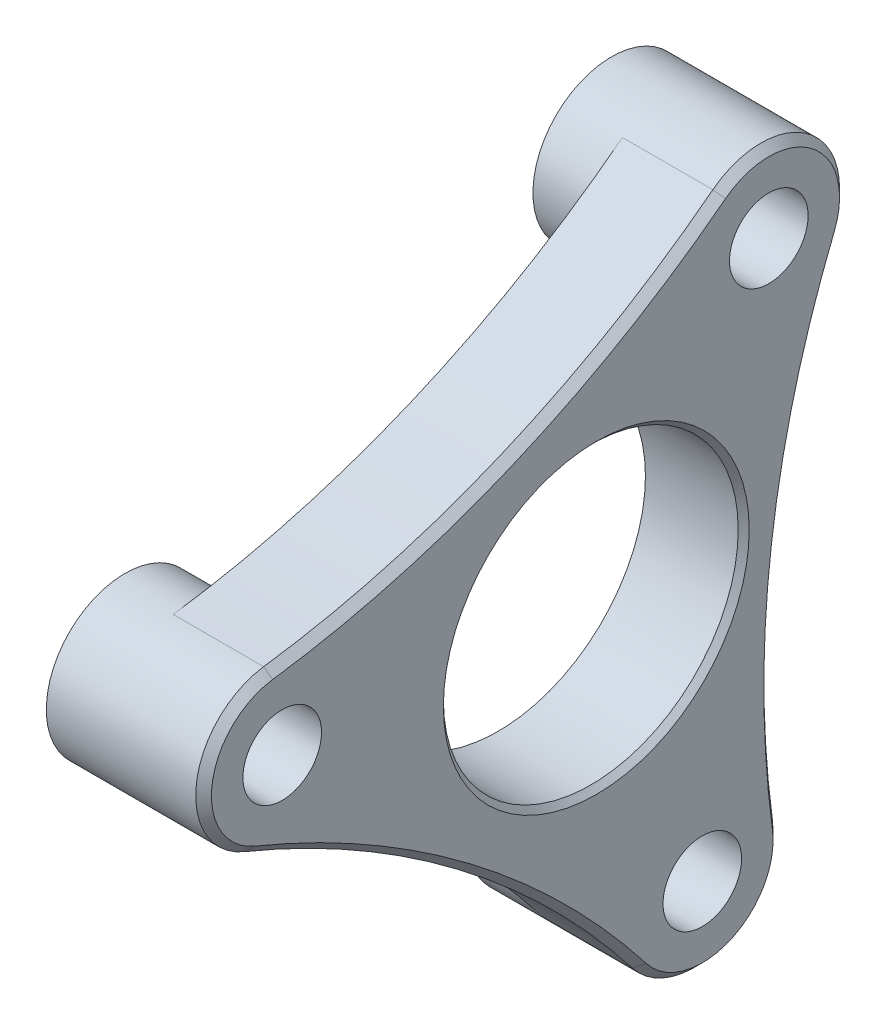
ISO-10303-21;
HEADER;
FILE_DESCRIPTION(('STEP AP214'),'2;1');
FILE_NAME('part.step','',(''),(''),'','','');
FILE_SCHEMA(('AUTOMOTIVE_DESIGN { 1 0 10303 214 1 1 1 1 }'));
ENDSEC;
DATA;
#1=APPLICATION_CONTEXT('core data for automotive mechanical design processes');
#2=APPLICATION_PROTOCOL_DEFINITION('international standard','automotive_design',2000,#1);
#3=PRODUCT_CONTEXT('',#1,'mechanical');
#4=PRODUCT('Part','Part','',(#3));
#5=PRODUCT_RELATED_PRODUCT_CATEGORY('part','',(#4));
#6=PRODUCT_DEFINITION_FORMATION('','',#4);
#7=PRODUCT_DEFINITION_CONTEXT('part definition',#1,'design');
#8=PRODUCT_DEFINITION('design','',#6,#7);
#9=PRODUCT_DEFINITION_SHAPE('','',#8);
#10=(LENGTH_UNIT() NAMED_UNIT(*) SI_UNIT(.MILLI.,.METRE.));
#11=(NAMED_UNIT(*) PLANE_ANGLE_UNIT() SI_UNIT($,.RADIAN.));
#12=(NAMED_UNIT(*) SI_UNIT($,.STERADIAN.) SOLID_ANGLE_UNIT());
#13=UNCERTAINTY_MEASURE_WITH_UNIT(LENGTH_MEASURE(1.E-05),#10,'distance_accuracy_value','');
#14=(GEOMETRIC_REPRESENTATION_CONTEXT(3) GLOBAL_UNCERTAINTY_ASSIGNED_CONTEXT((#13)) GLOBAL_UNIT_ASSIGNED_CONTEXT((#10,
#11,#12)) REPRESENTATION_CONTEXT('',''));
#15=CARTESIAN_POINT('',(0.,0.,0.));
#16=DIRECTION('',(0.,0.,1.));
#17=DIRECTION('',(1.,0.,0.));
#18=AXIS2_PLACEMENT_3D('',#15,#16,#17);
#19=CARTESIAN_POINT('',(-887.349,290.5125,-1549.4));
#20=DIRECTION('',(-1.,0.,0.));
#21=DIRECTION('',(0.,0.,1.));
#22=AXIS2_PLACEMENT_3D('',#19,#20,#21);
#23=CYLINDRICAL_SURFACE('',#22,23.8124999999999);
#24=CARTESIAN_POINT('',(-901.7,290.5125,-1549.4));
#25=DIRECTION('',(1.,0.,0.));
#26=DIRECTION('',(0.,0.,-1.));
#27=AXIS2_PLACEMENT_3D('',#24,#25,#26);
#28=CIRCLE('',#27,23.8124999999999);
#29=CARTESIAN_POINT('',(-901.7,290.5125,-1573.2125));
#30=VERTEX_POINT('',#29);
#31=EDGE_CURVE('E164',#30,#30,#28,.F.);
#32=ORIENTED_EDGE('',*,*,#31,.T.);
#33=EDGE_LOOP('',(#32));
#34=FACE_BOUND('',#33,.T.);
#35=CARTESIAN_POINT('',(-886.714,290.5125,-1549.4));
#36=DIRECTION('',(1.,0.,0.));
#37=DIRECTION('',(0.,0.,-1.));
#38=AXIS2_PLACEMENT_3D('',#35,#36,#37);
#39=CIRCLE('',#38,23.8124999999999);
#40=CARTESIAN_POINT('',(-886.714,290.5125,-1573.2125));
#41=VERTEX_POINT('',#40);
#42=EDGE_CURVE('E227',#41,#41,#39,.T.);
#43=ORIENTED_EDGE('',*,*,#42,.T.);
#44=EDGE_LOOP('',(#43));
#45=FACE_BOUND('',#44,.T.);
#46=ADVANCED_FACE('F37',(#34,#45),#23,.F.);
#47=CARTESIAN_POINT('',(-885.825,245.132576197376,-1566.52698056338));
#48=DIRECTION('',(-1.,0.,0.));
#49=DIRECTION('',(0.,0.,1.));
#50=AXIS2_PLACEMENT_3D('',#47,#48,#49);
#51=CYLINDRICAL_SURFACE('',#50,6.35000000000017);
#52=CARTESIAN_POINT('',(-885.825,245.132576197376,-1566.52698056338));
#53=DIRECTION('',(1.,0.,0.));
#54=DIRECTION('',(0.,0.,-1.));
#55=AXIS2_PLACEMENT_3D('',#52,#53,#54);
#56=CIRCLE('',#55,6.35000000000017);
#57=CARTESIAN_POINT('',(-885.825,245.132576197376,-1572.87698056338));
#58=VERTEX_POINT('',#57);
#59=EDGE_CURVE('E223',#58,#58,#56,.F.);
#60=ORIENTED_EDGE('',*,*,#59,.F.);
#61=EDGE_LOOP('',(#60));
#62=FACE_BOUND('',#61,.T.);
#63=CARTESIAN_POINT('',(-911.225,245.132576197376,-1566.52698056338));
#64=DIRECTION('',(1.,0.,0.));
#65=DIRECTION('',(0.,0.,-1.));
#66=AXIS2_PLACEMENT_3D('',#63,#64,#65);
#67=CIRCLE('',#66,6.35000000000017);
#68=CARTESIAN_POINT('',(-911.225,245.132576197376,-1572.87698056338));
#69=VERTEX_POINT('',#68);
#70=EDGE_CURVE('E218',#69,#69,#67,.F.);
#71=ORIENTED_EDGE('',*,*,#70,.T.);
#72=EDGE_LOOP('',(#71));
#73=FACE_BOUND('',#72,.T.);
#74=ADVANCED_FACE('F248',(#62,#73),#51,.F.);
#75=CARTESIAN_POINT('',(-885.825,245.132576197376,-1566.52698056338));
#76=DIRECTION('',(-1.,0.,0.));
#77=DIRECTION('',(0.,0.,1.));
#78=AXIS2_PLACEMENT_3D('',#75,#76,#77);
#79=CYLINDRICAL_SURFACE('',#78,12.6999999999999);
#80=DIRECTION('',(-1.,0.,0.));
#81=VECTOR('',#80,1.);
#82=CARTESIAN_POINT('',(-746.033840721288,246.83893817334,-1579.11182576731));
#83=LINE('',#82,#81);
#84=CARTESIAN_POINT('',(-887.095,246.83893817334,-1579.11182576731));
#85=VERTEX_POINT('',#84);
#86=CARTESIAN_POINT('',(-901.7,246.83893817334,-1579.11182576731));
#87=VERTEX_POINT('',#86);
#88=EDGE_CURVE('E217',#85,#87,#83,.T.);
#89=ORIENTED_EDGE('',*,*,#88,.F.);
#90=CARTESIAN_POINT('',(-887.095,245.132576197376,-1566.52698056338));
#91=DIRECTION('',(1.,0.,0.));
#92=DIRECTION('',(0.,0.,-1.));
#93=AXIS2_PLACEMENT_3D('',#90,#91,#92);
#94=CIRCLE('',#93,12.6999999999999);
#95=CARTESIAN_POINT('',(-887.095,237.348331115271,-1556.4922643989));
#96=VERTEX_POINT('',#95);
#97=EDGE_CURVE('E180',#85,#96,#94,.F.);
#98=ORIENTED_EDGE('',*,*,#97,.T.);
#99=DIRECTION('',(-1.,0.,0.));
#100=VECTOR('',#99,1.);
#101=CARTESIAN_POINT('',(-746.033840721288,237.348331115271,-1556.4922643989));
#102=LINE('',#101,#100);
#103=CARTESIAN_POINT('',(-901.7,237.348331115271,-1556.4922643989));
#104=VERTEX_POINT('',#103);
#105=EDGE_CURVE('E131',#96,#104,#102,.T.);
#106=ORIENTED_EDGE('',*,*,#105,.T.);
#107=CARTESIAN_POINT('',(-901.7,245.132576197376,-1566.52698056338));
#108=DIRECTION('',(1.,0.,0.));
#109=DIRECTION('',(0.,0.,-1.));
#110=AXIS2_PLACEMENT_3D('',#107,#108,#109);
#111=CIRCLE('',#110,12.6999999999999);
#112=EDGE_CURVE('E142',#87,#104,#111,.T.);
#113=ORIENTED_EDGE('',*,*,#112,.F.);
#114=EDGE_LOOP('',(#89,#98,#106,#113));
#115=FACE_BOUND('',#114,.T.);
#116=CARTESIAN_POINT('',(-911.225,245.132576197376,-1566.52698056338));
#117=DIRECTION('',(1.,0.,0.));
#118=DIRECTION('',(0.,0.,-1.));
#119=AXIS2_PLACEMENT_3D('',#116,#117,#118);
#120=CIRCLE('',#119,12.6999999999999);
#121=CARTESIAN_POINT('',(-911.225,245.132576197376,-1579.22698056338));
#122=VERTEX_POINT('',#121);
#123=EDGE_CURVE('E226',#122,#122,#120,.T.);
#124=ORIENTED_EDGE('',*,*,#123,.T.);
#125=EDGE_LOOP('',(#124));
#126=FACE_BOUND('',#125,.T.);
#127=ADVANCED_FACE('F254',(#115,#126),#79,.T.);
#128=CARTESIAN_POINT('',(-885.825,0.,0.));
#129=DIRECTION('',(1.,0.,0.));
#130=DIRECTION('',(0.,0.,-1.));
#131=AXIS2_PLACEMENT_3D('',#128,#129,#130);
#132=PLANE('',#131);
#133=CARTESIAN_POINT('',(-885.825,143.937390130013,-1436.07567042511));
#134=DIRECTION('',(1.,0.,0.));
#135=DIRECTION('',(0.,0.,-1.));
#136=AXIS2_PLACEMENT_3D('',#133,#134,#135);
#137=CIRCLE('',#136,153.67);
#138=CARTESIAN_POINT('',(-885.825,286.136307441143,-1494.33317479615));
#139=VERTEX_POINT('',#138);
#140=CARTESIAN_POINT('',(-885.825,238.126755623482,-1557.49573601534));
#141=VERTEX_POINT('',#140);
#142=EDGE_CURVE('E175',#139,#141,#137,.F.);
#143=ORIENTED_EDGE('',*,*,#142,.T.);
#144=CARTESIAN_POINT('',(-885.825,245.132576197376,-1566.52698056338));
#145=DIRECTION('',(1.,0.,0.));
#146=DIRECTION('',(0.,0.,-1.));
#147=AXIS2_PLACEMENT_3D('',#144,#145,#146);
#148=CIRCLE('',#147,11.43);
#149=CARTESIAN_POINT('',(-885.825,246.668301975743,-1577.85334124692));
#150=VERTEX_POINT('',#149);
#151=EDGE_CURVE('E177',#141,#150,#148,.T.);
#152=ORIENTED_EDGE('',*,*,#151,.T.);
#153=CARTESIAN_POINT('',(-885.825,267.315281884901,-1730.12996821452));
#154=DIRECTION('',(1.,0.,0.));
#155=DIRECTION('',(0.,0.,-1.));
#156=AXIS2_PLACEMENT_3D('',#153,#154,#155);
#157=CIRCLE('',#156,153.67);
#158=CARTESIAN_POINT('',(-885.825,325.373460468486,-1587.84955213572));
#159=VERTEX_POINT('',#158);
#160=EDGE_CURVE('E173',#150,#159,#157,.F.);
#161=ORIENTED_EDGE('',*,*,#160,.T.);
#162=CARTESIAN_POINT('',(-885.825,329.691837387926,-1577.26671127036));
#163=DIRECTION('',(1.,0.,0.));
#164=DIRECTION('',(0.,0.,-1.));
#165=AXIS2_PLACEMENT_3D('',#162,#163,#164);
#166=CIRCLE('',#165,11.43);
#167=CARTESIAN_POINT('',(-885.825,338.732890583114,-1570.27355339127));
#168=VERTEX_POINT('',#167);
#169=EDGE_CURVE('E169',#159,#168,#166,.T.);
#170=ORIENTED_EDGE('',*,*,#169,.T.);
#171=CARTESIAN_POINT('',(-885.825,460.284827985087,-1476.25443079471));
#172=DIRECTION('',(1.,0.,0.));
#173=DIRECTION('',(0.,0.,-1.));
#174=AXIS2_PLACEMENT_3D('',#171,#172,#173);
#175=CIRCLE('',#174,153.67);
#176=CARTESIAN_POINT('',(-885.825,308.037283908033,-1497.11478128328));
#177=VERTEX_POINT('',#176);
#178=EDGE_CURVE('E161',#168,#177,#175,.F.);
#179=ORIENTED_EDGE('',*,*,#178,.T.);
#180=CARTESIAN_POINT('',(-885.825,296.713086414699,-1498.66637760061));
#181=DIRECTION('',(1.,0.,0.));
#182=DIRECTION('',(0.,0.,-1.));
#183=AXIS2_PLACEMENT_3D('',#180,#181,#182);
#184=CIRCLE('',#183,11.43);
#185=EDGE_CURVE('E171',#177,#139,#184,.T.);
#186=ORIENTED_EDGE('',*,*,#185,.T.);
#187=EDGE_LOOP('',(#143,#152,#161,#170,#179,#186));
#188=FACE_BOUND('',#187,.T.);
#189=CARTESIAN_POINT('',(-885.825,290.5125,-1549.4));
#190=DIRECTION('',(1.,0.,0.));
#191=DIRECTION('',(0.,0.,-1.));
#192=AXIS2_PLACEMENT_3D('',#189,#190,#191);
#193=CIRCLE('',#192,24.7014999999999);
#194=CARTESIAN_POINT('',(-885.825,290.5125,-1574.1015));
#195=VERTEX_POINT('',#194);
#196=EDGE_CURVE('E167',#195,#195,#193,.F.);
#197=ORIENTED_EDGE('',*,*,#196,.T.);
#198=EDGE_LOOP('',(#197));
#199=FACE_BOUND('',#198,.T.);
#200=ORIENTED_EDGE('',*,*,#59,.T.);
#201=EDGE_LOOP('',(#200));
#202=FACE_BOUND('',#201,.T.);
#203=CARTESIAN_POINT('',(-885.825,296.713086414699,-1498.66637760061));
#204=DIRECTION('',(1.,0.,0.));
#205=DIRECTION('',(0.,0.,-1.));
#206=AXIS2_PLACEMENT_3D('',#203,#204,#205);
#207=CIRCLE('',#206,6.35000000000017);
#208=CARTESIAN_POINT('',(-885.825,296.713086414699,-1505.01637760061));
#209=VERTEX_POINT('',#208);
#210=EDGE_CURVE('E149',#209,#209,#207,.F.);
#211=ORIENTED_EDGE('',*,*,#210,.T.);
#212=EDGE_LOOP('',(#211));
#213=FACE_BOUND('',#212,.T.);
#214=CARTESIAN_POINT('',(-885.825,329.691837387926,-1577.26671127036));
#215=DIRECTION('',(1.,0.,0.));
#216=DIRECTION('',(0.,0.,-1.));
#217=AXIS2_PLACEMENT_3D('',#214,#215,#216);
#218=CIRCLE('',#217,6.35000000000017);
#219=CARTESIAN_POINT('',(-885.825,329.691837387926,-1583.61671127036));
#220=VERTEX_POINT('',#219);
#221=EDGE_CURVE('E152',#220,#220,#218,.F.);
#222=ORIENTED_EDGE('',*,*,#221,.T.);
#223=EDGE_LOOP('',(#222));
#224=FACE_BOUND('',#223,.T.);
#225=ADVANCED_FACE('F237',(#188,#199,#202,#213,#224),#132,.T.);
#226=CARTESIAN_POINT('',(-911.225,0.,0.));
#227=DIRECTION('',(1.,0.,0.));
#228=DIRECTION('',(0.,0.,-1.));
#229=AXIS2_PLACEMENT_3D('',#226,#227,#228);
#230=PLANE('',#229);
#231=ORIENTED_EDGE('',*,*,#70,.F.);
#232=EDGE_LOOP('',(#231));
#233=FACE_BOUND('',#232,.T.);
#234=ORIENTED_EDGE('',*,*,#123,.F.);
#235=EDGE_LOOP('',(#234));
#236=FACE_BOUND('',#235,.T.);
#237=ADVANCED_FACE('F281',(#233,#236),#230,.F.);
#238=CARTESIAN_POINT('',(-901.7,0.,0.));
#239=DIRECTION('',(1.,0.,0.));
#240=DIRECTION('',(0.,0.,-1.));
#241=AXIS2_PLACEMENT_3D('',#238,#239,#240);
#242=PLANE('',#241);
#243=ORIENTED_EDGE('',*,*,#31,.F.);
#244=EDGE_LOOP('',(#243));
#245=FACE_BOUND('',#244,.T.);
#246=CARTESIAN_POINT('',(-901.7,267.315281884901,-1730.12996821452));
#247=DIRECTION('',(1.,0.,0.));
#248=DIRECTION('',(0.,0.,-1.));
#249=AXIS2_PLACEMENT_3D('',#246,#247,#248);
#250=CIRCLE('',#249,152.4);
#251=CARTESIAN_POINT('',(-901.7,324.89364081077,-1589.02542334298));
#252=VERTEX_POINT('',#251);
#253=EDGE_CURVE('E136',#252,#87,#250,.T.);
#254=ORIENTED_EDGE('',*,*,#253,.T.);
#255=ORIENTED_EDGE('',*,*,#112,.T.);
#256=CARTESIAN_POINT('',(-901.7,143.937390130013,-1436.07567042511));
#257=DIRECTION('',(1.,0.,0.));
#258=DIRECTION('',(0.,0.,-1.));
#259=AXIS2_PLACEMENT_3D('',#256,#257,#258);
#260=CIRCLE('',#259,152.4);
#261=CARTESIAN_POINT('',(-901.7,284.961109777415,-1493.85170781788));
#262=VERTEX_POINT('',#261);
#263=EDGE_CURVE('E140',#104,#262,#260,.T.);
#264=ORIENTED_EDGE('',*,*,#263,.T.);
#265=CARTESIAN_POINT('',(-901.7,296.713086414699,-1498.66637760061));
#266=DIRECTION('',(1.,0.,0.));
#267=DIRECTION('',(0.,0.,-1.));
#268=AXIS2_PLACEMENT_3D('',#265,#266,#267);
#269=CIRCLE('',#268,12.6999999999999);
#270=CARTESIAN_POINT('',(-901.7,309.295528073959,-1496.94238169246));
#271=VERTEX_POINT('',#270);
#272=EDGE_CURVE('E126',#262,#271,#269,.T.);
#273=ORIENTED_EDGE('',*,*,#272,.T.);
#274=CARTESIAN_POINT('',(-901.7,460.284827985087,-1476.25443079471));
#275=DIRECTION('',(1.,0.,0.));
#276=DIRECTION('',(0.,0.,-1.));
#277=AXIS2_PLACEMENT_3D('',#274,#275,#276);
#278=CIRCLE('',#277,152.4);
#279=CARTESIAN_POINT('',(-901.7,339.737452049246,-1569.49653584915));
#280=VERTEX_POINT('',#279);
#281=EDGE_CURVE('E110',#271,#280,#278,.T.);
#282=ORIENTED_EDGE('',*,*,#281,.T.);
#283=CARTESIAN_POINT('',(-901.7,329.691837387926,-1577.26671127036));
#284=DIRECTION('',(1.,0.,0.));
#285=DIRECTION('',(0.,0.,-1.));
#286=AXIS2_PLACEMENT_3D('',#283,#284,#285);
#287=CIRCLE('',#286,12.6999999999999);
#288=EDGE_CURVE('E122',#280,#252,#287,.T.);
#289=ORIENTED_EDGE('',*,*,#288,.T.);
#290=EDGE_LOOP('',(#254,#255,#264,#273,#282,#289));
#291=FACE_BOUND('',#290,.T.);
#292=ADVANCED_FACE('F121',(#245,#291),#242,.F.);
#293=CARTESIAN_POINT('',(-746.033840721288,143.937390130013,-1436.07567042511));
#294=DIRECTION('',(-1.,0.,0.));
#295=DIRECTION('',(0.,0.,1.));
#296=AXIS2_PLACEMENT_3D('',#293,#294,#295);
#297=CYLINDRICAL_SURFACE('',#296,152.4);
#298=ORIENTED_EDGE('',*,*,#105,.F.);
#299=CARTESIAN_POINT('',(-887.095,143.937390130013,-1436.07567042511));
#300=DIRECTION('',(1.,0.,0.));
#301=DIRECTION('',(0.,0.,-1.));
#302=AXIS2_PLACEMENT_3D('',#299,#300,#301);
#303=CIRCLE('',#302,152.4);
#304=CARTESIAN_POINT('',(-887.095,284.961109777415,-1493.85170781788));
#305=VERTEX_POINT('',#304);
#306=EDGE_CURVE('E183',#96,#305,#303,.T.);
#307=ORIENTED_EDGE('',*,*,#306,.T.);
#308=DIRECTION('',(-1.,0.,0.));
#309=VECTOR('',#308,1.);
#310=CARTESIAN_POINT('',(-746.033840721288,284.961109777415,-1493.85170781788));
#311=LINE('',#310,#309);
#312=EDGE_CURVE('E133',#305,#262,#311,.T.);
#313=ORIENTED_EDGE('',*,*,#312,.T.);
#314=ORIENTED_EDGE('',*,*,#263,.F.);
#315=EDGE_LOOP('',(#298,#307,#313,#314));
#316=FACE_BOUND('',#315,.T.);
#317=ADVANCED_FACE('F280',(#316),#297,.F.);
#318=CARTESIAN_POINT('',(-746.033840721288,460.284827985087,-1476.25443079471));
#319=DIRECTION('',(-1.,0.,0.));
#320=DIRECTION('',(0.,0.,1.));
#321=AXIS2_PLACEMENT_3D('',#318,#319,#320);
#322=CYLINDRICAL_SURFACE('',#321,152.4);
#323=DIRECTION('',(-1.,0.,0.));
#324=VECTOR('',#323,1.);
#325=CARTESIAN_POINT('',(-746.033840721288,309.295528073959,-1496.94238169246));
#326=LINE('',#325,#324);
#327=CARTESIAN_POINT('',(-887.095,309.295528073959,-1496.94238169246));
#328=VERTEX_POINT('',#327);
#329=EDGE_CURVE('E114',#328,#271,#326,.T.);
#330=ORIENTED_EDGE('',*,*,#329,.F.);
#331=CARTESIAN_POINT('',(-887.095,460.284827985087,-1476.25443079471));
#332=DIRECTION('',(1.,0.,0.));
#333=DIRECTION('',(0.,0.,-1.));
#334=AXIS2_PLACEMENT_3D('',#331,#332,#333);
#335=CIRCLE('',#334,152.4);
#336=CARTESIAN_POINT('',(-887.095,339.737452049246,-1569.49653584915));
#337=VERTEX_POINT('',#336);
#338=EDGE_CURVE('E11',#328,#337,#335,.T.);
#339=ORIENTED_EDGE('',*,*,#338,.T.);
#340=DIRECTION('',(-1.,0.,0.));
#341=VECTOR('',#340,1.);
#342=CARTESIAN_POINT('',(-746.033840721288,339.737452049246,-1569.49653584915));
#343=LINE('',#342,#341);
#344=EDGE_CURVE('E107',#337,#280,#343,.T.);
#345=ORIENTED_EDGE('',*,*,#344,.T.);
#346=ORIENTED_EDGE('',*,*,#281,.F.);
#347=EDGE_LOOP('',(#330,#339,#345,#346));
#348=FACE_BOUND('',#347,.T.);
#349=ADVANCED_FACE('F109',(#348),#322,.F.);
#350=CARTESIAN_POINT('',(-746.033840721288,267.315281884901,-1730.12996821452));
#351=DIRECTION('',(-1.,0.,0.));
#352=DIRECTION('',(0.,0.,1.));
#353=AXIS2_PLACEMENT_3D('',#350,#351,#352);
#354=CYLINDRICAL_SURFACE('',#353,152.4);
#355=DIRECTION('',(-1.,0.,0.));
#356=VECTOR('',#355,1.);
#357=CARTESIAN_POINT('',(-746.033840721288,324.89364081077,-1589.02542334298));
#358=LINE('',#357,#356);
#359=CARTESIAN_POINT('',(-887.095,324.89364081077,-1589.02542334298));
#360=VERTEX_POINT('',#359);
#361=EDGE_CURVE('E115',#360,#252,#358,.T.);
#362=ORIENTED_EDGE('',*,*,#361,.F.);
#363=CARTESIAN_POINT('',(-887.095,267.315281884901,-1730.12996821452));
#364=DIRECTION('',(1.,0.,0.));
#365=DIRECTION('',(0.,0.,-1.));
#366=AXIS2_PLACEMENT_3D('',#363,#364,#365);
#367=CIRCLE('',#366,152.4);
#368=EDGE_CURVE('E185',#360,#85,#367,.T.);
#369=ORIENTED_EDGE('',*,*,#368,.T.);
#370=ORIENTED_EDGE('',*,*,#88,.T.);
#371=ORIENTED_EDGE('',*,*,#253,.F.);
#372=EDGE_LOOP('',(#362,#369,#370,#371));
#373=FACE_BOUND('',#372,.T.);
#374=ADVANCED_FACE('F215',(#373),#354,.F.);
#375=CARTESIAN_POINT('',(-885.825,296.713086414699,-1498.66637760061));
#376=DIRECTION('',(-1.,0.,0.));
#377=DIRECTION('',(0.,0.,1.));
#378=AXIS2_PLACEMENT_3D('',#375,#376,#377);
#379=CYLINDRICAL_SURFACE('',#378,6.35000000000017);
#380=ORIENTED_EDGE('',*,*,#210,.F.);
#381=EDGE_LOOP('',(#380));
#382=FACE_BOUND('',#381,.T.);
#383=CARTESIAN_POINT('',(-911.225,296.713086414699,-1498.66637760061));
#384=DIRECTION('',(1.,0.,0.));
#385=DIRECTION('',(0.,0.,-1.));
#386=AXIS2_PLACEMENT_3D('',#383,#384,#385);
#387=CIRCLE('',#386,6.35000000000017);
#388=CARTESIAN_POINT('',(-911.225,296.713086414699,-1505.01637760061));
#389=VERTEX_POINT('',#388);
#390=EDGE_CURVE('E148',#389,#389,#387,.F.);
#391=ORIENTED_EDGE('',*,*,#390,.T.);
#392=EDGE_LOOP('',(#391));
#393=FACE_BOUND('',#392,.T.);
#394=ADVANCED_FACE('F305',(#382,#393),#379,.F.);
#395=CARTESIAN_POINT('',(-885.825,296.713086414699,-1498.66637760061));
#396=DIRECTION('',(-1.,0.,0.));
#397=DIRECTION('',(0.,0.,1.));
#398=AXIS2_PLACEMENT_3D('',#395,#396,#397);
#399=CYLINDRICAL_SURFACE('',#398,12.6999999999999);
#400=ORIENTED_EDGE('',*,*,#312,.F.);
#401=CARTESIAN_POINT('',(-887.095,296.713086414699,-1498.66637760061));
#402=DIRECTION('',(1.,0.,0.));
#403=DIRECTION('',(0.,0.,-1.));
#404=AXIS2_PLACEMENT_3D('',#401,#402,#403);
#405=CIRCLE('',#404,12.6999999999999);
#406=EDGE_CURVE('E60',#305,#328,#405,.F.);
#407=ORIENTED_EDGE('',*,*,#406,.T.);
#408=ORIENTED_EDGE('',*,*,#329,.T.);
#409=ORIENTED_EDGE('',*,*,#272,.F.);
#410=EDGE_LOOP('',(#400,#407,#408,#409));
#411=FACE_BOUND('',#410,.T.);
#412=CARTESIAN_POINT('',(-911.225,296.713086414699,-1498.66637760061));
#413=DIRECTION('',(1.,0.,0.));
#414=DIRECTION('',(0.,0.,-1.));
#415=AXIS2_PLACEMENT_3D('',#412,#413,#414);
#416=CIRCLE('',#415,12.6999999999999);
#417=CARTESIAN_POINT('',(-911.225,296.713086414699,-1511.36637760061));
#418=VERTEX_POINT('',#417);
#419=EDGE_CURVE('E145',#418,#418,#416,.T.);
#420=ORIENTED_EDGE('',*,*,#419,.T.);
#421=EDGE_LOOP('',(#420));
#422=FACE_BOUND('',#421,.T.);
#423=ADVANCED_FACE('F308',(#411,#422),#399,.T.);
#424=CARTESIAN_POINT('',(-911.225,0.,0.));
#425=DIRECTION('',(1.,0.,0.));
#426=DIRECTION('',(0.,0.,-1.));
#427=AXIS2_PLACEMENT_3D('',#424,#425,#426);
#428=PLANE('',#427);
#429=ORIENTED_EDGE('',*,*,#390,.F.);
#430=EDGE_LOOP('',(#429));
#431=FACE_BOUND('',#430,.T.);
#432=ORIENTED_EDGE('',*,*,#419,.F.);
#433=EDGE_LOOP('',(#432));
#434=FACE_BOUND('',#433,.T.);
#435=ADVANCED_FACE('F312',(#431,#434),#428,.F.);
#436=CARTESIAN_POINT('',(-885.825,329.691837387926,-1577.26671127036));
#437=DIRECTION('',(-1.,0.,0.));
#438=DIRECTION('',(0.,0.,1.));
#439=AXIS2_PLACEMENT_3D('',#436,#437,#438);
#440=CYLINDRICAL_SURFACE('',#439,6.35000000000017);
#441=ORIENTED_EDGE('',*,*,#221,.F.);
#442=EDGE_LOOP('',(#441));
#443=FACE_BOUND('',#442,.T.);
#444=CARTESIAN_POINT('',(-911.225,329.691837387926,-1577.26671127036));
#445=DIRECTION('',(1.,0.,0.));
#446=DIRECTION('',(0.,0.,-1.));
#447=AXIS2_PLACEMENT_3D('',#444,#445,#446);
#448=CIRCLE('',#447,6.35000000000017);
#449=CARTESIAN_POINT('',(-911.225,329.691837387926,-1583.61671127036));
#450=VERTEX_POINT('',#449);
#451=EDGE_CURVE('E158',#450,#450,#448,.F.);
#452=ORIENTED_EDGE('',*,*,#451,.T.);
#453=EDGE_LOOP('',(#452));
#454=FACE_BOUND('',#453,.T.);
#455=ADVANCED_FACE('F315',(#443,#454),#440,.F.);
#456=CARTESIAN_POINT('',(-885.825,329.691837387926,-1577.26671127036));
#457=DIRECTION('',(-1.,0.,0.));
#458=DIRECTION('',(0.,0.,1.));
#459=AXIS2_PLACEMENT_3D('',#456,#457,#458);
#460=CYLINDRICAL_SURFACE('',#459,12.6999999999999);
#461=ORIENTED_EDGE('',*,*,#344,.F.);
#462=CARTESIAN_POINT('',(-887.095,329.691837387926,-1577.26671127036));
#463=DIRECTION('',(1.,0.,0.));
#464=DIRECTION('',(0.,0.,-1.));
#465=AXIS2_PLACEMENT_3D('',#462,#463,#464);
#466=CIRCLE('',#465,12.6999999999999);
#467=EDGE_CURVE('E46',#337,#360,#466,.F.);
#468=ORIENTED_EDGE('',*,*,#467,.T.);
#469=ORIENTED_EDGE('',*,*,#361,.T.);
#470=ORIENTED_EDGE('',*,*,#288,.F.);
#471=EDGE_LOOP('',(#461,#468,#469,#470));
#472=FACE_BOUND('',#471,.T.);
#473=CARTESIAN_POINT('',(-911.225,329.691837387926,-1577.26671127036));
#474=DIRECTION('',(1.,0.,0.));
#475=DIRECTION('',(0.,0.,-1.));
#476=AXIS2_PLACEMENT_3D('',#473,#474,#475);
#477=CIRCLE('',#476,12.6999999999999);
#478=CARTESIAN_POINT('',(-911.225,329.691837387926,-1589.96671127036));
#479=VERTEX_POINT('',#478);
#480=EDGE_CURVE('E155',#479,#479,#477,.T.);
#481=ORIENTED_EDGE('',*,*,#480,.T.);
#482=EDGE_LOOP('',(#481));
#483=FACE_BOUND('',#482,.T.);
#484=ADVANCED_FACE('F128',(#472,#483),#460,.T.);
#485=CARTESIAN_POINT('',(-911.225,0.,0.));
#486=DIRECTION('',(1.,0.,0.));
#487=DIRECTION('',(0.,0.,-1.));
#488=AXIS2_PLACEMENT_3D('',#485,#486,#487);
#489=PLANE('',#488);
#490=ORIENTED_EDGE('',*,*,#451,.F.);
#491=EDGE_LOOP('',(#490));
#492=FACE_BOUND('',#491,.T.);
#493=ORIENTED_EDGE('',*,*,#480,.F.);
#494=EDGE_LOOP('',(#493));
#495=FACE_BOUND('',#494,.T.);
#496=ADVANCED_FACE('F243',(#492,#495),#489,.F.);
#497=CARTESIAN_POINT('',(-886.714,290.5125,-1549.4));
#498=DIRECTION('',(1.,0.,0.));
#499=DIRECTION('',(0.,0.,-1.));
#500=AXIS2_PLACEMENT_3D('',#497,#498,#499);
#501=CONICAL_SURFACE('',#500,23.8124999999999,0.785398163397366);
#502=ORIENTED_EDGE('',*,*,#196,.F.);
#503=EDGE_LOOP('',(#502));
#504=FACE_BOUND('',#503,.T.);
#505=ORIENTED_EDGE('',*,*,#42,.F.);
#506=EDGE_LOOP('',(#505));
#507=FACE_BOUND('',#506,.T.);
#508=ADVANCED_FACE('F240',(#504,#507),#501,.F.);
#509=CARTESIAN_POINT('',(-887.095,460.284827985087,-1476.25443079471));
#510=DIRECTION('',(1.,0.,0.));
#511=DIRECTION('',(0.,0.,-1.));
#512=AXIS2_PLACEMENT_3D('',#509,#510,#511);
#513=CONICAL_SURFACE('',#512,152.4,0.785398163397459);
#514=DIRECTION('',(0.707106781186537,-0.559316712457228,-0.432625490656819));
#515=VECTOR('',#514,1.);
#516=CARTESIAN_POINT('',(-887.095,339.737452049246,-1569.49653584915));
#517=LINE('',#516,#515);
#518=EDGE_CURVE('E198',#337,#168,#517,.T.);
#519=ORIENTED_EDGE('',*,*,#518,.F.);
#520=ORIENTED_EDGE('',*,*,#338,.F.);
#521=DIRECTION('',(-0.707106781186546,0.70056140323995,0.0959881257785265));
#522=VECTOR('',#521,1.);
#523=CARTESIAN_POINT('',(-885.825,308.037283908033,-1497.11478128328));
#524=LINE('',#523,#522);
#525=EDGE_CURVE('E41',#177,#328,#524,.T.);
#526=ORIENTED_EDGE('',*,*,#525,.F.);
#527=ORIENTED_EDGE('',*,*,#178,.F.);
#528=EDGE_LOOP('',(#519,#520,#526,#527));
#529=FACE_BOUND('',#528,.T.);
#530=ADVANCED_FACE('F39',(#529),#513,.F.);
#531=CARTESIAN_POINT('',(-885.825,296.713086414699,-1498.66637760061));
#532=DIRECTION('',(-1.,0.,0.));
#533=DIRECTION('',(0.,0.,1.));
#534=AXIS2_PLACEMENT_3D('',#531,#532,#533);
#535=CONICAL_SURFACE('',#534,11.43,0.785398163397465);
#536=ORIENTED_EDGE('',*,*,#525,.T.);
#537=ORIENTED_EDGE('',*,*,#406,.F.);
#538=DIRECTION('',(-0.707106781186537,-0.654323021462128,0.268069736420742));
#539=VECTOR('',#538,1.);
#540=CARTESIAN_POINT('',(-885.825,286.136307441143,-1494.33317479615));
#541=LINE('',#540,#539);
#542=EDGE_CURVE('E196',#139,#305,#541,.T.);
#543=ORIENTED_EDGE('',*,*,#542,.F.);
#544=ORIENTED_EDGE('',*,*,#185,.F.);
#545=EDGE_LOOP('',(#536,#537,#543,#544));
#546=FACE_BOUND('',#545,.T.);
#547=ADVANCED_FACE('F207',(#546),#535,.T.);
#548=CARTESIAN_POINT('',(-885.825,329.691837387926,-1577.26671127036));
#549=DIRECTION('',(-1.,0.,0.));
#550=DIRECTION('',(0.,0.,1.));
#551=AXIS2_PLACEMENT_3D('',#548,#549,#550);
#552=CONICAL_SURFACE('',#551,11.43,0.785398163397467);
#553=ORIENTED_EDGE('',*,*,#518,.T.);
#554=ORIENTED_EDGE('',*,*,#169,.F.);
#555=DIRECTION('',(0.70710678118649,0.267152546234072,0.654698035006012));
#556=VECTOR('',#555,1.);
#557=CARTESIAN_POINT('',(-887.095,324.89364081077,-1589.02542334298));
#558=LINE('',#557,#556);
#559=EDGE_CURVE('E193',#360,#159,#558,.T.);
#560=ORIENTED_EDGE('',*,*,#559,.F.);
#561=ORIENTED_EDGE('',*,*,#467,.F.);
#562=EDGE_LOOP('',(#553,#554,#560,#561));
#563=FACE_BOUND('',#562,.T.);
#564=ADVANCED_FACE('F212',(#563),#552,.T.);
#565=CARTESIAN_POINT('',(-887.095,143.937390130013,-1436.07567042511));
#566=DIRECTION('',(1.,0.,0.));
#567=DIRECTION('',(0.,0.,-1.));
#568=AXIS2_PLACEMENT_3D('',#565,#566,#567);
#569=CONICAL_SURFACE('',#568,152.4,0.785398163397459);
#570=ORIENTED_EDGE('',*,*,#542,.T.);
#571=ORIENTED_EDGE('',*,*,#306,.F.);
#572=DIRECTION('',(-0.707106781186532,-0.433408857005865,0.558709909227402));
#573=VECTOR('',#572,1.);
#574=CARTESIAN_POINT('',(-885.825,238.126755623482,-1557.49573601534));
#575=LINE('',#574,#573);
#576=EDGE_CURVE('E191',#141,#96,#575,.T.);
#577=ORIENTED_EDGE('',*,*,#576,.F.);
#578=ORIENTED_EDGE('',*,*,#142,.F.);
#579=EDGE_LOOP('',(#570,#571,#577,#578));
#580=FACE_BOUND('',#579,.T.);
#581=ADVANCED_FACE('F266',(#580),#569,.F.);
#582=CARTESIAN_POINT('',(-887.095,267.315281884901,-1730.12996821452));
#583=DIRECTION('',(1.,0.,0.));
#584=DIRECTION('',(0.,0.,-1.));
#585=AXIS2_PLACEMENT_3D('',#582,#583,#584);
#586=CONICAL_SURFACE('',#585,152.4,0.785398163397492);
#587=ORIENTED_EDGE('',*,*,#559,.T.);
#588=ORIENTED_EDGE('',*,*,#160,.F.);
#589=DIRECTION('',(0.707106781186475,-0.0950063090049378,0.700695227077623));
#590=VECTOR('',#589,1.);
#591=CARTESIAN_POINT('',(-887.095,246.83893817334,-1579.11182576731));
#592=LINE('',#591,#590);
#593=EDGE_CURVE('E189',#85,#150,#592,.T.);
#594=ORIENTED_EDGE('',*,*,#593,.F.);
#595=ORIENTED_EDGE('',*,*,#368,.F.);
#596=EDGE_LOOP('',(#587,#588,#594,#595));
#597=FACE_BOUND('',#596,.T.);
#598=ADVANCED_FACE('F271',(#597),#586,.F.);
#599=CARTESIAN_POINT('',(-885.825,245.132576197376,-1566.52698056338));
#600=DIRECTION('',(-1.,0.,0.));
#601=DIRECTION('',(0.,0.,1.));
#602=AXIS2_PLACEMENT_3D('',#599,#600,#601);
#603=CONICAL_SURFACE('',#602,11.43,0.785398163397462);
#604=ORIENTED_EDGE('',*,*,#576,.T.);
#605=ORIENTED_EDGE('',*,*,#97,.F.);
#606=ORIENTED_EDGE('',*,*,#593,.T.);
#607=ORIENTED_EDGE('',*,*,#151,.F.);
#608=EDGE_LOOP('',(#604,#605,#606,#607));
#609=FACE_BOUND('',#608,.T.);
#610=ADVANCED_FACE('F275',(#609),#603,.T.);
#611=CLOSED_SHELL('',(#46,#74,#127,#225,#237,#292,#317,#349,#374,#394,#423,#435,#455,#484,#496,
#508,#530,#547,#564,#581,#598,#610));
#612=MANIFOLD_SOLID_BREP('B2',#611);
#613=ADVANCED_BREP_SHAPE_REPRESENTATION('',(#18,#612),#14);
#614=SHAPE_DEFINITION_REPRESENTATION(#9,#613);
ENDSEC;
END-ISO-10303-21;
